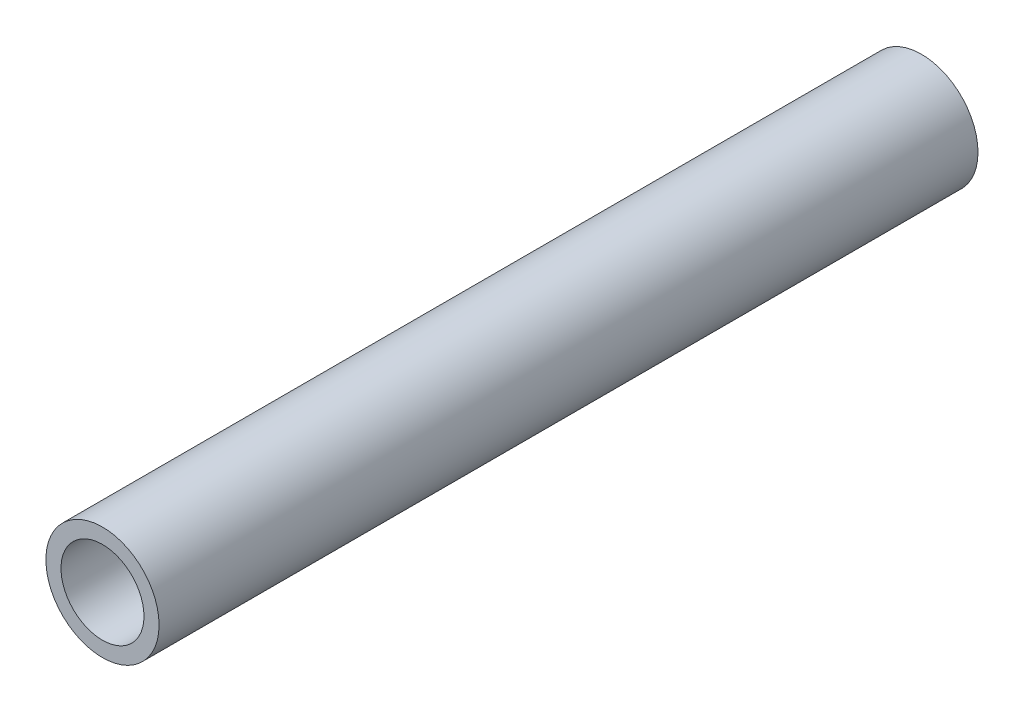
ISO-10303-21;
HEADER;
FILE_DESCRIPTION(('STEP AP214'),'2;1');
FILE_NAME('part.step','',(''),(''),'','','');
FILE_SCHEMA(('AUTOMOTIVE_DESIGN { 1 0 10303 214 1 1 1 1 }'));
ENDSEC;
DATA;
#1=APPLICATION_CONTEXT('core data for automotive mechanical design processes');
#2=APPLICATION_PROTOCOL_DEFINITION('international standard','automotive_design',2000,#1);
#3=PRODUCT_CONTEXT('',#1,'mechanical');
#4=PRODUCT('Part','Part','',(#3));
#5=PRODUCT_RELATED_PRODUCT_CATEGORY('part','',(#4));
#6=PRODUCT_DEFINITION_FORMATION('','',#4);
#7=PRODUCT_DEFINITION_CONTEXT('part definition',#1,'design');
#8=PRODUCT_DEFINITION('design','',#6,#7);
#9=PRODUCT_DEFINITION_SHAPE('','',#8);
#10=(LENGTH_UNIT() NAMED_UNIT(*) SI_UNIT(.MILLI.,.METRE.));
#11=(NAMED_UNIT(*) PLANE_ANGLE_UNIT() SI_UNIT($,.RADIAN.));
#12=(NAMED_UNIT(*) SI_UNIT($,.STERADIAN.) SOLID_ANGLE_UNIT());
#13=UNCERTAINTY_MEASURE_WITH_UNIT(LENGTH_MEASURE(1.E-05),#10,'distance_accuracy_value','');
#14=(GEOMETRIC_REPRESENTATION_CONTEXT(3) GLOBAL_UNCERTAINTY_ASSIGNED_CONTEXT((#13)) GLOBAL_UNIT_ASSIGNED_CONTEXT((#10,
#11,#12)) REPRESENTATION_CONTEXT('',''));
#15=CARTESIAN_POINT('',(0.,0.,0.));
#16=DIRECTION('',(0.,0.,1.));
#17=DIRECTION('',(1.,0.,0.));
#18=AXIS2_PLACEMENT_3D('',#15,#16,#17);
#19=CARTESIAN_POINT('',(0.,0.,533.4));
#20=DIRECTION('',(0.,0.,1.));
#21=DIRECTION('',(1.,0.,0.));
#22=AXIS2_PLACEMENT_3D('',#19,#20,#21);
#23=PLANE('',#22);
#24=CARTESIAN_POINT('',(0.,0.,533.4));
#25=DIRECTION('',(0.,0.,1.));
#26=DIRECTION('',(1.,0.,0.));
#27=AXIS2_PLACEMENT_3D('',#24,#25,#26);
#28=CIRCLE('',#27,36.856385821769);
#29=CARTESIAN_POINT('',(36.856385821769,0.,533.4));
#30=VERTEX_POINT('',#29);
#31=EDGE_CURVE('E10',#30,#30,#28,.T.);
#32=ORIENTED_EDGE('',*,*,#31,.T.);
#33=EDGE_LOOP('',(#32));
#34=FACE_BOUND('',#33,.T.);
#35=CARTESIAN_POINT('',(0.,0.,533.4));
#36=DIRECTION('',(0.,0.,1.));
#37=DIRECTION('',(1.,0.,0.));
#38=AXIS2_PLACEMENT_3D('',#35,#36,#37);
#39=CIRCLE('',#38,27.0272127733396);
#40=CARTESIAN_POINT('',(27.0272127733396,0.,533.4));
#41=VERTEX_POINT('',#40);
#42=EDGE_CURVE('E42',#41,#41,#39,.T.);
#43=ORIENTED_EDGE('',*,*,#42,.F.);
#44=EDGE_LOOP('',(#43));
#45=FACE_BOUND('',#44,.T.);
#46=ADVANCED_FACE('F31',(#34,#45),#23,.T.);
#47=CARTESIAN_POINT('',(0.,0.,0.));
#48=DIRECTION('',(0.,0.,1.));
#49=DIRECTION('',(1.,0.,0.));
#50=AXIS2_PLACEMENT_3D('',#47,#48,#49);
#51=PLANE('',#50);
#52=CARTESIAN_POINT('',(0.,0.,0.));
#53=DIRECTION('',(0.,0.,1.));
#54=DIRECTION('',(1.,0.,0.));
#55=AXIS2_PLACEMENT_3D('',#52,#53,#54);
#56=CIRCLE('',#55,36.856385821769);
#57=CARTESIAN_POINT('',(36.856385821769,0.,0.));
#58=VERTEX_POINT('',#57);
#59=EDGE_CURVE('E35',#58,#58,#56,.T.);
#60=ORIENTED_EDGE('',*,*,#59,.F.);
#61=EDGE_LOOP('',(#60));
#62=FACE_BOUND('',#61,.T.);
#63=CARTESIAN_POINT('',(0.,0.,0.));
#64=DIRECTION('',(0.,0.,1.));
#65=DIRECTION('',(1.,0.,0.));
#66=AXIS2_PLACEMENT_3D('',#63,#64,#65);
#67=CIRCLE('',#66,27.0272127733396);
#68=CARTESIAN_POINT('',(27.0272127733396,0.,0.));
#69=VERTEX_POINT('',#68);
#70=EDGE_CURVE('E44',#69,#69,#67,.T.);
#71=ORIENTED_EDGE('',*,*,#70,.T.);
#72=EDGE_LOOP('',(#71));
#73=FACE_BOUND('',#72,.T.);
#74=ADVANCED_FACE('F54',(#62,#73),#51,.F.);
#75=CARTESIAN_POINT('',(0.,0.,533.4));
#76=DIRECTION('',(0.,0.,-1.));
#77=DIRECTION('',(-1.,0.,0.));
#78=AXIS2_PLACEMENT_3D('',#75,#76,#77);
#79=CYLINDRICAL_SURFACE('',#78,36.856385821769);
#80=ORIENTED_EDGE('',*,*,#31,.F.);
#81=EDGE_LOOP('',(#80));
#82=FACE_BOUND('',#81,.T.);
#83=ORIENTED_EDGE('',*,*,#59,.T.);
#84=EDGE_LOOP('',(#83));
#85=FACE_BOUND('',#84,.T.);
#86=ADVANCED_FACE('F33',(#82,#85),#79,.T.);
#87=CARTESIAN_POINT('',(0.,0.,533.4));
#88=DIRECTION('',(0.,0.,-1.));
#89=DIRECTION('',(-1.,0.,0.));
#90=AXIS2_PLACEMENT_3D('',#87,#88,#89);
#91=CYLINDRICAL_SURFACE('',#90,27.0272127733396);
#92=ORIENTED_EDGE('',*,*,#42,.T.);
#93=EDGE_LOOP('',(#92));
#94=FACE_BOUND('',#93,.T.);
#95=ORIENTED_EDGE('',*,*,#70,.F.);
#96=EDGE_LOOP('',(#95));
#97=FACE_BOUND('',#96,.T.);
#98=ADVANCED_FACE('F50',(#94,#97),#91,.F.);
#99=CLOSED_SHELL('',(#46,#74,#86,#98));
#100=MANIFOLD_SOLID_BREP('B2',#99);
#101=ADVANCED_BREP_SHAPE_REPRESENTATION('',(#18,#100),#14);
#102=SHAPE_DEFINITION_REPRESENTATION(#9,#101);
ENDSEC;
END-ISO-10303-21;
